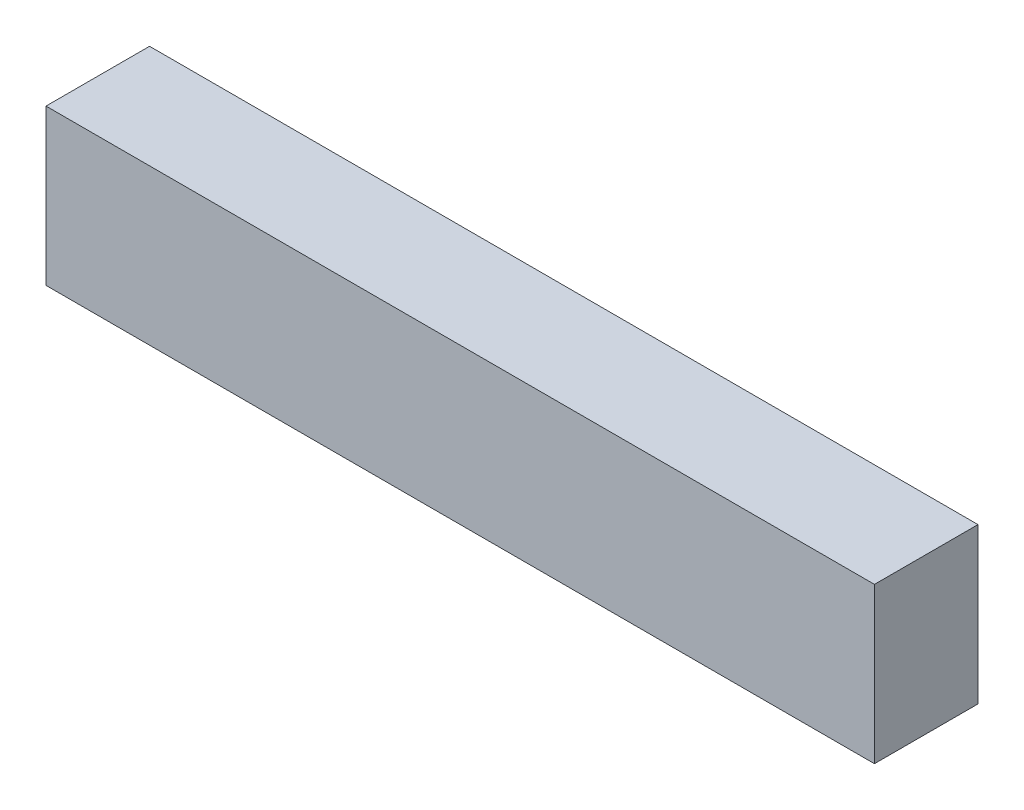
ISO-10303-21;
HEADER;
FILE_DESCRIPTION(('STEP AP214'),'2;1');
FILE_NAME('part.step','',(''),(''),'','','');
FILE_SCHEMA(('AUTOMOTIVE_DESIGN { 1 0 10303 214 1 1 1 1 }'));
ENDSEC;
DATA;
#1=APPLICATION_CONTEXT('core data for automotive mechanical design processes');
#2=APPLICATION_PROTOCOL_DEFINITION('international standard','automotive_design',2000,#1);
#3=PRODUCT_CONTEXT('',#1,'mechanical');
#4=PRODUCT('Part','Part','',(#3));
#5=PRODUCT_RELATED_PRODUCT_CATEGORY('part','',(#4));
#6=PRODUCT_DEFINITION_FORMATION('','',#4);
#7=PRODUCT_DEFINITION_CONTEXT('part definition',#1,'design');
#8=PRODUCT_DEFINITION('design','',#6,#7);
#9=PRODUCT_DEFINITION_SHAPE('','',#8);
#10=(LENGTH_UNIT() NAMED_UNIT(*) SI_UNIT(.MILLI.,.METRE.));
#11=(NAMED_UNIT(*) PLANE_ANGLE_UNIT() SI_UNIT($,.RADIAN.));
#12=(NAMED_UNIT(*) SI_UNIT($,.STERADIAN.) SOLID_ANGLE_UNIT());
#13=UNCERTAINTY_MEASURE_WITH_UNIT(LENGTH_MEASURE(1.E-05),#10,'distance_accuracy_value','');
#14=(GEOMETRIC_REPRESENTATION_CONTEXT(3) GLOBAL_UNCERTAINTY_ASSIGNED_CONTEXT((#13)) GLOBAL_UNIT_ASSIGNED_CONTEXT((#10,
#11,#12)) REPRESENTATION_CONTEXT('',''));
#15=CARTESIAN_POINT('',(0.,0.,0.));
#16=DIRECTION('',(0.,0.,1.));
#17=DIRECTION('',(1.,0.,0.));
#18=AXIS2_PLACEMENT_3D('',#15,#16,#17);
#19=CARTESIAN_POINT('',(4.,0.75,1.));
#20=DIRECTION('',(-1.,0.,0.));
#21=DIRECTION('',(0.,0.,1.));
#22=AXIS2_PLACEMENT_3D('',#19,#20,#21);
#23=PLANE('',#22);
#24=DIRECTION('',(0.,1.,0.));
#25=VECTOR('',#24,1.);
#26=CARTESIAN_POINT('',(4.,0.75,0.));
#27=LINE('',#26,#25);
#28=CARTESIAN_POINT('',(4.,-0.75,0.));
#29=VERTEX_POINT('',#28);
#30=CARTESIAN_POINT('',(4.,0.75,0.));
#31=VERTEX_POINT('',#30);
#32=EDGE_CURVE('E98',#29,#31,#27,.T.);
#33=ORIENTED_EDGE('',*,*,#32,.T.);
#34=DIRECTION('',(0.,0.,-1.));
#35=VECTOR('',#34,1.);
#36=CARTESIAN_POINT('',(4.,0.75,1.));
#37=LINE('',#36,#35);
#38=CARTESIAN_POINT('',(4.,0.75,1.));
#39=VERTEX_POINT('',#38);
#40=EDGE_CURVE('E11',#39,#31,#37,.T.);
#41=ORIENTED_EDGE('',*,*,#40,.F.);
#42=DIRECTION('',(0.,1.,0.));
#43=VECTOR('',#42,1.);
#44=CARTESIAN_POINT('',(4.,0.75,1.));
#45=LINE('',#44,#43);
#46=CARTESIAN_POINT('',(4.,-0.75,1.));
#47=VERTEX_POINT('',#46);
#48=EDGE_CURVE('E86',#47,#39,#45,.T.);
#49=ORIENTED_EDGE('',*,*,#48,.F.);
#50=DIRECTION('',(0.,0.,-1.));
#51=VECTOR('',#50,1.);
#52=CARTESIAN_POINT('',(4.,-0.75,1.));
#53=LINE('',#52,#51);
#54=EDGE_CURVE('E94',#47,#29,#53,.T.);
#55=ORIENTED_EDGE('',*,*,#54,.T.);
#56=EDGE_LOOP('',(#33,#41,#49,#55));
#57=FACE_BOUND('',#56,.T.);
#58=ADVANCED_FACE('F35',(#57),#23,.F.);
#59=CARTESIAN_POINT('',(-4.,0.75,1.));
#60=DIRECTION('',(0.,-1.,0.));
#61=DIRECTION('',(0.,0.,-1.));
#62=AXIS2_PLACEMENT_3D('',#59,#60,#61);
#63=PLANE('',#62);
#64=DIRECTION('',(-1.,0.,0.));
#65=VECTOR('',#64,1.);
#66=CARTESIAN_POINT('',(-4.,0.75,0.));
#67=LINE('',#66,#65);
#68=CARTESIAN_POINT('',(-4.,0.75,0.));
#69=VERTEX_POINT('',#68);
#70=EDGE_CURVE('E90',#31,#69,#67,.T.);
#71=ORIENTED_EDGE('',*,*,#70,.T.);
#72=DIRECTION('',(0.,0.,-1.));
#73=VECTOR('',#72,1.);
#74=CARTESIAN_POINT('',(-4.,0.75,1.));
#75=LINE('',#74,#73);
#76=CARTESIAN_POINT('',(-4.,0.75,1.));
#77=VERTEX_POINT('',#76);
#78=EDGE_CURVE('E43',#77,#69,#75,.T.);
#79=ORIENTED_EDGE('',*,*,#78,.F.);
#80=DIRECTION('',(-1.,0.,0.));
#81=VECTOR('',#80,1.);
#82=CARTESIAN_POINT('',(-4.,0.75,1.));
#83=LINE('',#82,#81);
#84=EDGE_CURVE('E81',#39,#77,#83,.T.);
#85=ORIENTED_EDGE('',*,*,#84,.F.);
#86=ORIENTED_EDGE('',*,*,#40,.T.);
#87=EDGE_LOOP('',(#71,#79,#85,#86));
#88=FACE_BOUND('',#87,.T.);
#89=ADVANCED_FACE('F89',(#88),#63,.F.);
#90=CARTESIAN_POINT('',(-4.,0.75,1.));
#91=DIRECTION('',(1.,0.,0.));
#92=DIRECTION('',(0.,0.,-1.));
#93=AXIS2_PLACEMENT_3D('',#90,#91,#92);
#94=PLANE('',#93);
#95=DIRECTION('',(0.,-1.,0.));
#96=VECTOR('',#95,1.);
#97=CARTESIAN_POINT('',(-4.,0.75,0.));
#98=LINE('',#97,#96);
#99=CARTESIAN_POINT('',(-4.,-0.75,0.));
#100=VERTEX_POINT('',#99);
#101=EDGE_CURVE('E68',#69,#100,#98,.T.);
#102=ORIENTED_EDGE('',*,*,#101,.T.);
#103=DIRECTION('',(0.,0.,-1.));
#104=VECTOR('',#103,1.);
#105=CARTESIAN_POINT('',(-4.,-0.75,1.));
#106=LINE('',#105,#104);
#107=CARTESIAN_POINT('',(-4.,-0.75,1.));
#108=VERTEX_POINT('',#107);
#109=EDGE_CURVE('E91',#108,#100,#106,.T.);
#110=ORIENTED_EDGE('',*,*,#109,.F.);
#111=DIRECTION('',(0.,-1.,0.));
#112=VECTOR('',#111,1.);
#113=CARTESIAN_POINT('',(-4.,0.75,1.));
#114=LINE('',#113,#112);
#115=EDGE_CURVE('E84',#77,#108,#114,.T.);
#116=ORIENTED_EDGE('',*,*,#115,.F.);
#117=ORIENTED_EDGE('',*,*,#78,.T.);
#118=EDGE_LOOP('',(#102,#110,#116,#117));
#119=FACE_BOUND('',#118,.T.);
#120=ADVANCED_FACE('F92',(#119),#94,.F.);
#121=CARTESIAN_POINT('',(-4.,-0.75,1.));
#122=DIRECTION('',(0.,1.,0.));
#123=DIRECTION('',(0.,0.,1.));
#124=AXIS2_PLACEMENT_3D('',#121,#122,#123);
#125=PLANE('',#124);
#126=DIRECTION('',(1.,0.,0.));
#127=VECTOR('',#126,1.);
#128=CARTESIAN_POINT('',(-4.,-0.75,0.));
#129=LINE('',#128,#127);
#130=EDGE_CURVE('E74',#100,#29,#129,.T.);
#131=ORIENTED_EDGE('',*,*,#130,.T.);
#132=ORIENTED_EDGE('',*,*,#54,.F.);
#133=DIRECTION('',(1.,0.,0.));
#134=VECTOR('',#133,1.);
#135=CARTESIAN_POINT('',(-4.,-0.75,1.));
#136=LINE('',#135,#134);
#137=EDGE_CURVE('E51',#108,#47,#136,.T.);
#138=ORIENTED_EDGE('',*,*,#137,.F.);
#139=ORIENTED_EDGE('',*,*,#109,.T.);
#140=EDGE_LOOP('',(#131,#132,#138,#139));
#141=FACE_BOUND('',#140,.T.);
#142=ADVANCED_FACE('F105',(#141),#125,.F.);
#143=CARTESIAN_POINT('',(0.,0.,1.));
#144=DIRECTION('',(0.,0.,1.));
#145=DIRECTION('',(1.,0.,0.));
#146=AXIS2_PLACEMENT_3D('',#143,#144,#145);
#147=PLANE('',#146);
#148=ORIENTED_EDGE('',*,*,#48,.T.);
#149=ORIENTED_EDGE('',*,*,#84,.T.);
#150=ORIENTED_EDGE('',*,*,#115,.T.);
#151=ORIENTED_EDGE('',*,*,#137,.T.);
#152=EDGE_LOOP('',(#148,#149,#150,#151));
#153=FACE_BOUND('',#152,.T.);
#154=ADVANCED_FACE('F82',(#153),#147,.T.);
#155=CARTESIAN_POINT('',(0.,0.,0.));
#156=DIRECTION('',(0.,0.,1.));
#157=DIRECTION('',(1.,0.,0.));
#158=AXIS2_PLACEMENT_3D('',#155,#156,#157);
#159=PLANE('',#158);
#160=ORIENTED_EDGE('',*,*,#32,.F.);
#161=ORIENTED_EDGE('',*,*,#130,.F.);
#162=ORIENTED_EDGE('',*,*,#101,.F.);
#163=ORIENTED_EDGE('',*,*,#70,.F.);
#164=EDGE_LOOP('',(#160,#161,#162,#163));
#165=FACE_BOUND('',#164,.T.);
#166=ADVANCED_FACE('F108',(#165),#159,.F.);
#167=CLOSED_SHELL('',(#58,#89,#120,#142,#154,#166));
#168=MANIFOLD_SOLID_BREP('B2',#167);
#169=ADVANCED_BREP_SHAPE_REPRESENTATION('',(#18,#168),#14);
#170=SHAPE_DEFINITION_REPRESENTATION(#9,#169);
ENDSEC;
END-ISO-10303-21;
